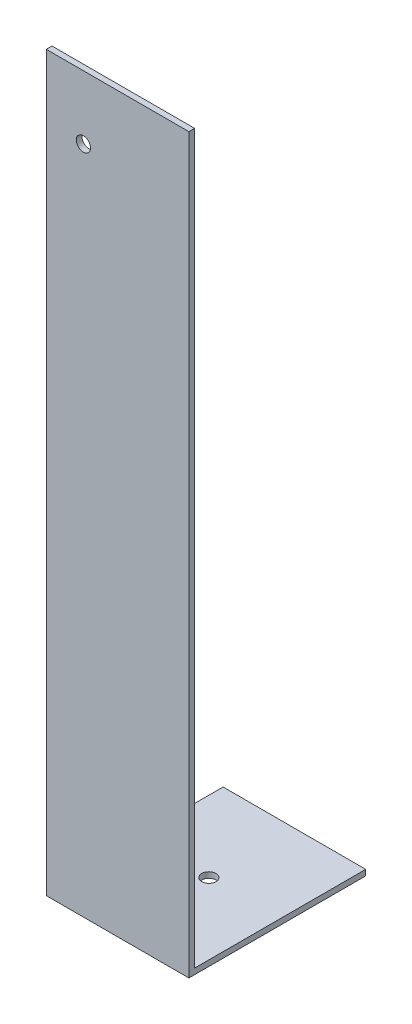
ISO-10303-21;
HEADER;
FILE_DESCRIPTION(('STEP AP214'),'2;1');
FILE_NAME('part.step','',(''),(''),'','','');
FILE_SCHEMA(('AUTOMOTIVE_DESIGN { 1 0 10303 214 1 1 1 1 }'));
ENDSEC;
DATA;
#1=APPLICATION_CONTEXT('core data for automotive mechanical design processes');
#2=APPLICATION_PROTOCOL_DEFINITION('international standard','automotive_design',2000,#1);
#3=PRODUCT_CONTEXT('',#1,'mechanical');
#4=PRODUCT('Part','Part','',(#3));
#5=PRODUCT_RELATED_PRODUCT_CATEGORY('part','',(#4));
#6=PRODUCT_DEFINITION_FORMATION('','',#4);
#7=PRODUCT_DEFINITION_CONTEXT('part definition',#1,'design');
#8=PRODUCT_DEFINITION('design','',#6,#7);
#9=PRODUCT_DEFINITION_SHAPE('','',#8);
#10=(LENGTH_UNIT() NAMED_UNIT(*) SI_UNIT(.MILLI.,.METRE.));
#11=(NAMED_UNIT(*) PLANE_ANGLE_UNIT() SI_UNIT($,.RADIAN.));
#12=(NAMED_UNIT(*) SI_UNIT($,.STERADIAN.) SOLID_ANGLE_UNIT());
#13=UNCERTAINTY_MEASURE_WITH_UNIT(LENGTH_MEASURE(1.E-05),#10,'distance_accuracy_value','');
#14=(GEOMETRIC_REPRESENTATION_CONTEXT(3) GLOBAL_UNCERTAINTY_ASSIGNED_CONTEXT((#13)) GLOBAL_UNIT_ASSIGNED_CONTEXT((#10,
#11,#12)) REPRESENTATION_CONTEXT('',''));
#15=CARTESIAN_POINT('',(0.,0.,0.));
#16=DIRECTION('',(0.,0.,1.));
#17=DIRECTION('',(1.,0.,0.));
#18=AXIS2_PLACEMENT_3D('',#15,#16,#17);
#19=CARTESIAN_POINT('',(50.,-215.034421420622,-41.7603050757246));
#20=DIRECTION('',(0.,1.,0.));
#21=DIRECTION('',(0.,0.,1.));
#22=AXIS2_PLACEMENT_3D('',#19,#20,#21);
#23=PLANE('',#22);
#24=CARTESIAN_POINT('',(25.,-215.034421420622,-11.7603050757246));
#25=DIRECTION('',(0.,1.,0.));
#26=DIRECTION('',(0.,0.,1.));
#27=AXIS2_PLACEMENT_3D('',#24,#25,#26);
#28=CIRCLE('',#27,2.5);
#29=CARTESIAN_POINT('',(25.,-215.034421420622,-9.26030507572456));
#30=VERTEX_POINT('',#29);
#31=EDGE_CURVE('E133',#30,#30,#28,.T.);
#32=ORIENTED_EDGE('',*,*,#31,.T.);
#33=EDGE_LOOP('',(#32));
#34=FACE_BOUND('',#33,.T.);
#35=DIRECTION('',(0.,0.,-1.));
#36=VECTOR('',#35,1.);
#37=CARTESIAN_POINT('',(0.,-215.034421420622,-41.7603050757246));
#38=LINE('',#37,#36);
#39=CARTESIAN_POINT('',(0.,-215.034421420622,20.2396949242755));
#40=VERTEX_POINT('',#39);
#41=CARTESIAN_POINT('',(0.,-215.034421420622,-41.7603050757246));
#42=VERTEX_POINT('',#41);
#43=EDGE_CURVE('E128',#40,#42,#38,.T.);
#44=ORIENTED_EDGE('',*,*,#43,.T.);
#45=DIRECTION('',(-1.,0.,0.));
#46=VECTOR('',#45,1.);
#47=CARTESIAN_POINT('',(50.,-215.034421420622,-41.7603050757246));
#48=LINE('',#47,#46);
#49=CARTESIAN_POINT('',(50.,-215.034421420622,-41.7603050757246));
#50=VERTEX_POINT('',#49);
#51=EDGE_CURVE('E11',#50,#42,#48,.T.);
#52=ORIENTED_EDGE('',*,*,#51,.F.);
#53=DIRECTION('',(0.,0.,-1.));
#54=VECTOR('',#53,1.);
#55=CARTESIAN_POINT('',(50.,-215.034421420622,-41.7603050757246));
#56=LINE('',#55,#54);
#57=CARTESIAN_POINT('',(50.,-215.034421420622,20.2396949242755));
#58=VERTEX_POINT('',#57);
#59=EDGE_CURVE('E145',#58,#50,#56,.T.);
#60=ORIENTED_EDGE('',*,*,#59,.F.);
#61=DIRECTION('',(-1.,0.,0.));
#62=VECTOR('',#61,1.);
#63=CARTESIAN_POINT('',(50.,-215.034421420622,20.2396949242755));
#64=LINE('',#63,#62);
#65=EDGE_CURVE('E124',#58,#40,#64,.T.);
#66=ORIENTED_EDGE('',*,*,#65,.T.);
#67=EDGE_LOOP('',(#44,#52,#60,#66));
#68=FACE_BOUND('',#67,.T.);
#69=ADVANCED_FACE('F38',(#34,#68),#23,.F.);
#70=CARTESIAN_POINT('',(50.,-213.034421420622,-41.7603050757246));
#71=DIRECTION('',(0.,0.,1.));
#72=DIRECTION('',(1.,0.,0.));
#73=AXIS2_PLACEMENT_3D('',#70,#71,#72);
#74=PLANE('',#73);
#75=DIRECTION('',(0.,1.,0.));
#76=VECTOR('',#75,1.);
#77=CARTESIAN_POINT('',(0.,-213.034421420622,-41.7603050757246));
#78=LINE('',#77,#76);
#79=CARTESIAN_POINT('',(0.,-213.034421420622,-41.7603050757246));
#80=VERTEX_POINT('',#79);
#81=EDGE_CURVE('E132',#42,#80,#78,.T.);
#82=ORIENTED_EDGE('',*,*,#81,.T.);
#83=DIRECTION('',(-1.,0.,0.));
#84=VECTOR('',#83,1.);
#85=CARTESIAN_POINT('',(50.,-213.034421420622,-41.7603050757246));
#86=LINE('',#85,#84);
#87=CARTESIAN_POINT('',(50.,-213.034421420622,-41.7603050757246));
#88=VERTEX_POINT('',#87);
#89=EDGE_CURVE('E48',#88,#80,#86,.T.);
#90=ORIENTED_EDGE('',*,*,#89,.F.);
#91=DIRECTION('',(0.,1.,0.));
#92=VECTOR('',#91,1.);
#93=CARTESIAN_POINT('',(50.,-213.034421420622,-41.7603050757246));
#94=LINE('',#93,#92);
#95=EDGE_CURVE('E93',#50,#88,#94,.T.);
#96=ORIENTED_EDGE('',*,*,#95,.F.);
#97=ORIENTED_EDGE('',*,*,#51,.T.);
#98=EDGE_LOOP('',(#82,#90,#96,#97));
#99=FACE_BOUND('',#98,.T.);
#100=ADVANCED_FACE('F176',(#99),#74,.F.);
#101=CARTESIAN_POINT('',(50.,-213.034421420622,18.2396949242754));
#102=DIRECTION('',(0.,-1.,0.));
#103=DIRECTION('',(0.,0.,-1.));
#104=AXIS2_PLACEMENT_3D('',#101,#102,#103);
#105=PLANE('',#104);
#106=CARTESIAN_POINT('',(25.,-213.034421420622,-11.7603050757246));
#107=DIRECTION('',(0.,1.,0.));
#108=DIRECTION('',(0.,0.,1.));
#109=AXIS2_PLACEMENT_3D('',#106,#107,#108);
#110=CIRCLE('',#109,2.5);
#111=CARTESIAN_POINT('',(25.,-213.034421420622,-9.26030507572456));
#112=VERTEX_POINT('',#111);
#113=EDGE_CURVE('E185',#112,#112,#110,.T.);
#114=ORIENTED_EDGE('',*,*,#113,.F.);
#115=EDGE_LOOP('',(#114));
#116=FACE_BOUND('',#115,.T.);
#117=DIRECTION('',(0.,0.,1.));
#118=VECTOR('',#117,1.);
#119=CARTESIAN_POINT('',(0.,-213.034421420622,18.2396949242754));
#120=LINE('',#119,#118);
#121=CARTESIAN_POINT('',(0.,-213.034421420622,18.2396949242754));
#122=VERTEX_POINT('',#121);
#123=EDGE_CURVE('E136',#80,#122,#120,.T.);
#124=ORIENTED_EDGE('',*,*,#123,.T.);
#125=DIRECTION('',(-1.,0.,0.));
#126=VECTOR('',#125,1.);
#127=CARTESIAN_POINT('',(50.,-213.034421420622,18.2396949242754));
#128=LINE('',#127,#126);
#129=CARTESIAN_POINT('',(50.,-213.034421420622,18.2396949242754));
#130=VERTEX_POINT('',#129);
#131=EDGE_CURVE('E117',#130,#122,#128,.T.);
#132=ORIENTED_EDGE('',*,*,#131,.F.);
#133=DIRECTION('',(0.,0.,1.));
#134=VECTOR('',#133,1.);
#135=CARTESIAN_POINT('',(50.,-213.034421420622,18.2396949242754));
#136=LINE('',#135,#134);
#137=EDGE_CURVE('E106',#88,#130,#136,.T.);
#138=ORIENTED_EDGE('',*,*,#137,.F.);
#139=ORIENTED_EDGE('',*,*,#89,.T.);
#140=EDGE_LOOP('',(#124,#132,#138,#139));
#141=FACE_BOUND('',#140,.T.);
#142=ADVANCED_FACE('F156',(#116,#141),#105,.F.);
#143=CARTESIAN_POINT('',(50.,41.9655785793779,18.2396949242755));
#144=DIRECTION('',(0.,0.,1.));
#145=DIRECTION('',(0.,-1.,0.));
#146=AXIS2_PLACEMENT_3D('',#143,#144,#145);
#147=PLANE('',#146);
#148=CARTESIAN_POINT('',(13.01,19.7305785793779,18.2396949242755));
#149=DIRECTION('',(0.,0.,-1.));
#150=DIRECTION('',(0.,1.,0.));
#151=AXIS2_PLACEMENT_3D('',#148,#149,#150);
#152=CIRCLE('',#151,2.5);
#153=CARTESIAN_POINT('',(13.01,22.2305785793779,18.2396949242755));
#154=VERTEX_POINT('',#153);
#155=EDGE_CURVE('E196',#154,#154,#152,.T.);
#156=ORIENTED_EDGE('',*,*,#155,.F.);
#157=EDGE_LOOP('',(#156));
#158=FACE_BOUND('',#157,.T.);
#159=DIRECTION('',(0.,1.,0.));
#160=VECTOR('',#159,1.);
#161=CARTESIAN_POINT('',(0.,41.9655785793779,18.2396949242755));
#162=LINE('',#161,#160);
#163=CARTESIAN_POINT('',(0.,41.9655785793779,18.2396949242755));
#164=VERTEX_POINT('',#163);
#165=EDGE_CURVE('E115',#122,#164,#162,.T.);
#166=ORIENTED_EDGE('',*,*,#165,.T.);
#167=DIRECTION('',(-1.,0.,0.));
#168=VECTOR('',#167,1.);
#169=CARTESIAN_POINT('',(50.,41.9655785793779,18.2396949242755));
#170=LINE('',#169,#168);
#171=CARTESIAN_POINT('',(50.,41.9655785793779,18.2396949242755));
#172=VERTEX_POINT('',#171);
#173=EDGE_CURVE('E112',#172,#164,#170,.T.);
#174=ORIENTED_EDGE('',*,*,#173,.F.);
#175=DIRECTION('',(0.,1.,0.));
#176=VECTOR('',#175,1.);
#177=CARTESIAN_POINT('',(50.,41.9655785793779,18.2396949242755));
#178=LINE('',#177,#176);
#179=EDGE_CURVE('E100',#130,#172,#178,.T.);
#180=ORIENTED_EDGE('',*,*,#179,.F.);
#181=ORIENTED_EDGE('',*,*,#131,.T.);
#182=EDGE_LOOP('',(#166,#174,#180,#181));
#183=FACE_BOUND('',#182,.T.);
#184=ADVANCED_FACE('F113',(#158,#183),#147,.F.);
#185=CARTESIAN_POINT('',(50.,41.9655785793779,20.2396949242755));
#186=DIRECTION('',(0.,-1.,0.));
#187=DIRECTION('',(0.,0.,-1.));
#188=AXIS2_PLACEMENT_3D('',#185,#186,#187);
#189=PLANE('',#188);
#190=DIRECTION('',(0.,0.,1.));
#191=VECTOR('',#190,1.);
#192=CARTESIAN_POINT('',(0.,41.9655785793779,20.2396949242755));
#193=LINE('',#192,#191);
#194=CARTESIAN_POINT('',(0.,41.9655785793779,20.2396949242755));
#195=VERTEX_POINT('',#194);
#196=EDGE_CURVE('E79',#164,#195,#193,.T.);
#197=ORIENTED_EDGE('',*,*,#196,.T.);
#198=DIRECTION('',(-1.,0.,0.));
#199=VECTOR('',#198,1.);
#200=CARTESIAN_POINT('',(50.,41.9655785793779,20.2396949242755));
#201=LINE('',#200,#199);
#202=CARTESIAN_POINT('',(50.,41.9655785793779,20.2396949242755));
#203=VERTEX_POINT('',#202);
#204=EDGE_CURVE('E118',#203,#195,#201,.T.);
#205=ORIENTED_EDGE('',*,*,#204,.F.);
#206=DIRECTION('',(0.,0.,1.));
#207=VECTOR('',#206,1.);
#208=CARTESIAN_POINT('',(50.,41.9655785793779,20.2396949242755));
#209=LINE('',#208,#207);
#210=EDGE_CURVE('E104',#172,#203,#209,.T.);
#211=ORIENTED_EDGE('',*,*,#210,.F.);
#212=ORIENTED_EDGE('',*,*,#173,.T.);
#213=EDGE_LOOP('',(#197,#205,#211,#212));
#214=FACE_BOUND('',#213,.T.);
#215=ADVANCED_FACE('F120',(#214),#189,.F.);
#216=CARTESIAN_POINT('',(50.,-215.034421420622,20.2396949242755));
#217=DIRECTION('',(0.,0.,-1.));
#218=DIRECTION('',(-1.,0.,0.));
#219=AXIS2_PLACEMENT_3D('',#216,#217,#218);
#220=PLANE('',#219);
#221=CARTESIAN_POINT('',(13.01,19.7305785793779,20.2396949242755));
#222=DIRECTION('',(0.,0.,-1.));
#223=DIRECTION('',(-1.,0.,0.));
#224=AXIS2_PLACEMENT_3D('',#221,#222,#223);
#225=CIRCLE('',#224,2.5);
#226=CARTESIAN_POINT('',(10.51,19.7305785793779,20.2396949242755));
#227=VERTEX_POINT('',#226);
#228=EDGE_CURVE('E41',#227,#227,#225,.T.);
#229=ORIENTED_EDGE('',*,*,#228,.T.);
#230=EDGE_LOOP('',(#229));
#231=FACE_BOUND('',#230,.T.);
#232=DIRECTION('',(0.,-1.,0.));
#233=VECTOR('',#232,1.);
#234=CARTESIAN_POINT('',(0.,-215.034421420622,20.2396949242755));
#235=LINE('',#234,#233);
#236=EDGE_CURVE('E85',#195,#40,#235,.T.);
#237=ORIENTED_EDGE('',*,*,#236,.T.);
#238=ORIENTED_EDGE('',*,*,#65,.F.);
#239=DIRECTION('',(0.,-1.,0.));
#240=VECTOR('',#239,1.);
#241=CARTESIAN_POINT('',(50.,-215.034421420622,20.2396949242755));
#242=LINE('',#241,#240);
#243=EDGE_CURVE('E56',#203,#58,#242,.T.);
#244=ORIENTED_EDGE('',*,*,#243,.F.);
#245=ORIENTED_EDGE('',*,*,#204,.T.);
#246=EDGE_LOOP('',(#237,#238,#244,#245));
#247=FACE_BOUND('',#246,.T.);
#248=ADVANCED_FACE('F163',(#231,#247),#220,.F.);
#249=CARTESIAN_POINT('',(50.,0.,0.));
#250=DIRECTION('',(-1.,0.,0.));
#251=DIRECTION('',(0.,0.,1.));
#252=AXIS2_PLACEMENT_3D('',#249,#250,#251);
#253=PLANE('',#252);
#254=ORIENTED_EDGE('',*,*,#59,.T.);
#255=ORIENTED_EDGE('',*,*,#95,.T.);
#256=ORIENTED_EDGE('',*,*,#137,.T.);
#257=ORIENTED_EDGE('',*,*,#179,.T.);
#258=ORIENTED_EDGE('',*,*,#210,.T.);
#259=ORIENTED_EDGE('',*,*,#243,.T.);
#260=EDGE_LOOP('',(#254,#255,#256,#257,#258,#259));
#261=FACE_BOUND('',#260,.T.);
#262=ADVANCED_FACE('F102',(#261),#253,.F.);
#263=CARTESIAN_POINT('',(0.,0.,0.));
#264=DIRECTION('',(-1.,0.,0.));
#265=DIRECTION('',(0.,0.,1.));
#266=AXIS2_PLACEMENT_3D('',#263,#264,#265);
#267=PLANE('',#266);
#268=ORIENTED_EDGE('',*,*,#43,.F.);
#269=ORIENTED_EDGE('',*,*,#236,.F.);
#270=ORIENTED_EDGE('',*,*,#196,.F.);
#271=ORIENTED_EDGE('',*,*,#165,.F.);
#272=ORIENTED_EDGE('',*,*,#123,.F.);
#273=ORIENTED_EDGE('',*,*,#81,.F.);
#274=EDGE_LOOP('',(#268,#269,#270,#271,#272,#273));
#275=FACE_BOUND('',#274,.T.);
#276=ADVANCED_FACE('F159',(#275),#267,.T.);
#277=CARTESIAN_POINT('',(25.,-223.034421420622,-11.7603050757246));
#278=DIRECTION('',(0.,1.,0.));
#279=DIRECTION('',(0.,0.,1.));
#280=AXIS2_PLACEMENT_3D('',#277,#278,#279);
#281=CYLINDRICAL_SURFACE('',#280,2.5);
#282=ORIENTED_EDGE('',*,*,#113,.T.);
#283=EDGE_LOOP('',(#282));
#284=FACE_BOUND('',#283,.T.);
#285=ORIENTED_EDGE('',*,*,#31,.F.);
#286=EDGE_LOOP('',(#285));
#287=FACE_BOUND('',#286,.T.);
#288=ADVANCED_FACE('F206',(#284,#287),#281,.F.);
#289=CARTESIAN_POINT('',(13.01,19.7305785793779,28.2396949242755));
#290=DIRECTION('',(0.,0.,-1.));
#291=DIRECTION('',(0.,1.,0.));
#292=AXIS2_PLACEMENT_3D('',#289,#290,#291);
#293=CYLINDRICAL_SURFACE('',#292,2.5);
#294=ORIENTED_EDGE('',*,*,#155,.T.);
#295=EDGE_LOOP('',(#294));
#296=FACE_BOUND('',#295,.T.);
#297=ORIENTED_EDGE('',*,*,#228,.F.);
#298=EDGE_LOOP('',(#297));
#299=FACE_BOUND('',#298,.T.);
#300=ADVANCED_FACE('F204',(#296,#299),#293,.F.);
#301=CLOSED_SHELL('',(#69,#100,#142,#184,#215,#248,#262,#276,#288,#300));
#302=MANIFOLD_SOLID_BREP('B2',#301);
#303=ADVANCED_BREP_SHAPE_REPRESENTATION('',(#18,#302),#14);
#304=SHAPE_DEFINITION_REPRESENTATION(#9,#303);
ENDSEC;
END-ISO-10303-21;
